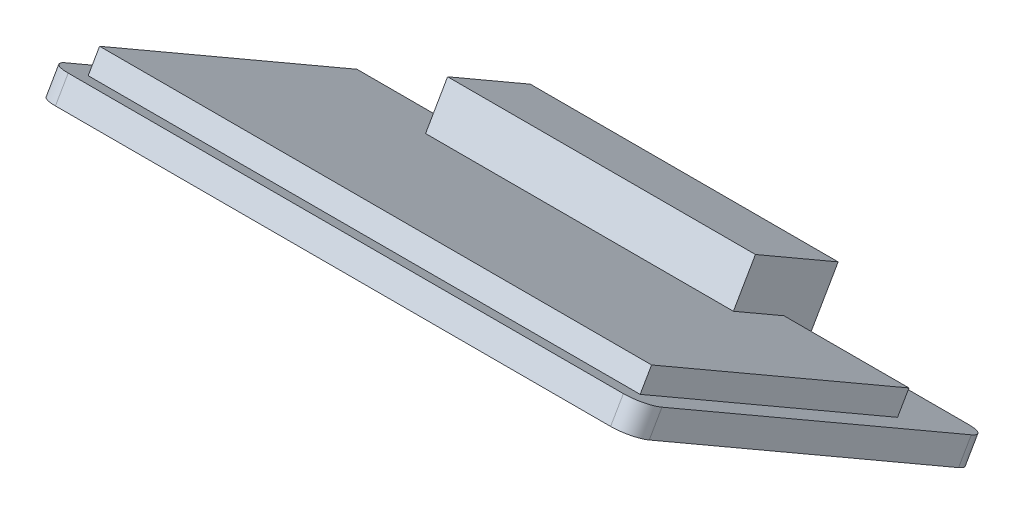
ISO-10303-21;
HEADER;
FILE_DESCRIPTION(('STEP AP214'),'2;1');
FILE_NAME('part.step','',(''),(''),'','','');
FILE_SCHEMA(('AUTOMOTIVE_DESIGN { 1 0 10303 214 1 1 1 1 }'));
ENDSEC;
DATA;
#1=APPLICATION_CONTEXT('core data for automotive mechanical design processes');
#2=APPLICATION_PROTOCOL_DEFINITION('international standard','automotive_design',2000,#1);
#3=PRODUCT_CONTEXT('',#1,'mechanical');
#4=PRODUCT('Part','Part','',(#3));
#5=PRODUCT_RELATED_PRODUCT_CATEGORY('part','',(#4));
#6=PRODUCT_DEFINITION_FORMATION('','',#4);
#7=PRODUCT_DEFINITION_CONTEXT('part definition',#1,'design');
#8=PRODUCT_DEFINITION('design','',#6,#7);
#9=PRODUCT_DEFINITION_SHAPE('','',#8);
#10=(LENGTH_UNIT() NAMED_UNIT(*) SI_UNIT(.MILLI.,.METRE.));
#11=(NAMED_UNIT(*) PLANE_ANGLE_UNIT() SI_UNIT($,.RADIAN.));
#12=(NAMED_UNIT(*) SI_UNIT($,.STERADIAN.) SOLID_ANGLE_UNIT());
#13=UNCERTAINTY_MEASURE_WITH_UNIT(LENGTH_MEASURE(1.E-05),#10,'distance_accuracy_value','');
#14=(GEOMETRIC_REPRESENTATION_CONTEXT(3) GLOBAL_UNCERTAINTY_ASSIGNED_CONTEXT((#13)) GLOBAL_UNIT_ASSIGNED_CONTEXT((#10,
#11,#12)) REPRESENTATION_CONTEXT('',''));
#15=CARTESIAN_POINT('',(0.,0.,0.));
#16=DIRECTION('',(0.,0.,1.));
#17=DIRECTION('',(1.,0.,0.));
#18=AXIS2_PLACEMENT_3D('',#15,#16,#17);
#19=CARTESIAN_POINT('',(-29.55,15.411215932168,24.693009000929));
#20=DIRECTION('',(0.,-0.50000000000019,-0.866025403784329));
#21=DIRECTION('',(0.,-0.866025403784329,0.50000000000019));
#22=AXIS2_PLACEMENT_3D('',#19,#20,#21);
#23=PLANE('',#22);
#24=DIRECTION('',(0.,0.866025403784329,-0.50000000000019));
#25=VECTOR('',#24,1.);
#26=CARTESIAN_POINT('',(-29.55,15.411215932168,24.693009000929));
#27=LINE('',#26,#25);
#28=CARTESIAN_POINT('',(-29.55,15.411215932168,24.693009000929));
#29=VERTEX_POINT('',#28);
#30=CARTESIAN_POINT('',(-29.55,25.28390553531,18.993009000929));
#31=VERTEX_POINT('',#30);
#32=EDGE_CURVE('E343',#29,#31,#27,.T.);
#33=ORIENTED_EDGE('',*,*,#32,.T.);
#34=DIRECTION('',(1.,0.,0.));
#35=VECTOR('',#34,1.);
#36=CARTESIAN_POINT('',(-29.55,25.28390553531,18.993009000929));
#37=LINE('',#36,#35);
#38=CARTESIAN_POINT('',(28.45,25.28390553531,18.993009000929));
#39=VERTEX_POINT('',#38);
#40=EDGE_CURVE('E11',#31,#39,#37,.T.);
#41=ORIENTED_EDGE('',*,*,#40,.T.);
#42=DIRECTION('',(0.,0.866025403784329,-0.50000000000019));
#43=VECTOR('',#42,1.);
#44=CARTESIAN_POINT('',(28.45,15.411215932168,24.693009000929));
#45=LINE('',#44,#43);
#46=CARTESIAN_POINT('',(28.45,15.411215932168,24.693009000929));
#47=VERTEX_POINT('',#46);
#48=EDGE_CURVE('E324',#47,#39,#45,.T.);
#49=ORIENTED_EDGE('',*,*,#48,.F.);
#50=DIRECTION('',(1.,0.,0.));
#51=VECTOR('',#50,1.);
#52=CARTESIAN_POINT('',(-29.55,15.411215932168,24.693009000929));
#53=LINE('',#52,#51);
#54=EDGE_CURVE('E299',#29,#47,#53,.T.);
#55=ORIENTED_EDGE('',*,*,#54,.F.);
#56=EDGE_LOOP('',(#33,#41,#49,#55));
#57=FACE_BOUND('',#56,.T.);
#58=ADVANCED_FACE('F17',(#57),#23,.T.);
#59=CARTESIAN_POINT('',(-0.55,29.78390553531,26.787237634989));
#60=DIRECTION('',(0.,-0.866025403784329,0.50000000000019));
#61=DIRECTION('',(-1.,0.,0.));
#62=AXIS2_PLACEMENT_3D('',#59,#60,#61);
#63=PLANE('',#62);
#64=DIRECTION('',(0.,-0.50000000000019,-0.866025403784329));
#65=VECTOR('',#64,1.);
#66=CARTESIAN_POINT('',(-29.55,34.28390553531,34.581466269049));
#67=LINE('',#66,#65);
#68=CARTESIAN_POINT('',(-29.55,34.28390553531,34.581466269049));
#69=VERTEX_POINT('',#68);
#70=EDGE_CURVE('E298',#69,#31,#67,.T.);
#71=ORIENTED_EDGE('',*,*,#70,.F.);
#72=DIRECTION('',(-1.,0.,0.));
#73=VECTOR('',#72,1.);
#74=CARTESIAN_POINT('',(28.45,34.28390553531,34.581466269049));
#75=LINE('',#74,#73);
#76=CARTESIAN_POINT('',(28.45,34.28390553531,34.581466269049));
#77=VERTEX_POINT('',#76);
#78=EDGE_CURVE('E21',#77,#69,#75,.T.);
#79=ORIENTED_EDGE('',*,*,#78,.F.);
#80=DIRECTION('',(0.,0.50000000000019,0.866025403784329));
#81=VECTOR('',#80,1.);
#82=CARTESIAN_POINT('',(28.45,25.28390553531,18.993009000929));
#83=LINE('',#82,#81);
#84=EDGE_CURVE('E328',#39,#77,#83,.T.);
#85=ORIENTED_EDGE('',*,*,#84,.F.);
#86=ORIENTED_EDGE('',*,*,#40,.F.);
#87=EDGE_LOOP('',(#71,#79,#85,#86));
#88=FACE_BOUND('',#87,.T.);
#89=ADVANCED_FACE('F19',(#88),#63,.F.);
#90=CARTESIAN_POINT('',(28.45,24.411215932168,40.281466269049));
#91=DIRECTION('',(0.,0.50000000000019,0.866025403784329));
#92=DIRECTION('',(1.,0.,0.));
#93=AXIS2_PLACEMENT_3D('',#90,#91,#92);
#94=PLANE('',#93);
#95=DIRECTION('',(-1.,0.,0.));
#96=VECTOR('',#95,1.);
#97=CARTESIAN_POINT('',(14.225,27.095894683899,38.731466269049));
#98=LINE('',#97,#96);
#99=CARTESIAN_POINT('',(28.45,27.095894683899,38.731466269049));
#100=VERTEX_POINT('',#99);
#101=CARTESIAN_POINT('',(-29.55,27.095894683899,38.731466269049));
#102=VERTEX_POINT('',#101);
#103=EDGE_CURVE('E320',#100,#102,#98,.T.);
#104=ORIENTED_EDGE('',*,*,#103,.F.);
#105=DIRECTION('',(0.,0.866025403784329,-0.50000000000019));
#106=VECTOR('',#105,1.);
#107=CARTESIAN_POINT('',(28.45,24.411215932168,40.281466269049));
#108=LINE('',#107,#106);
#109=EDGE_CURVE('E334',#100,#77,#108,.T.);
#110=ORIENTED_EDGE('',*,*,#109,.T.);
#111=ORIENTED_EDGE('',*,*,#78,.T.);
#112=DIRECTION('',(0.,0.866025403784329,-0.50000000000019));
#113=VECTOR('',#112,1.);
#114=CARTESIAN_POINT('',(-29.55,24.411215932168,40.281466269049));
#115=LINE('',#114,#113);
#116=EDGE_CURVE('E294',#102,#69,#115,.T.);
#117=ORIENTED_EDGE('',*,*,#116,.F.);
#118=EDGE_LOOP('',(#104,#110,#111,#117));
#119=FACE_BOUND('',#118,.T.);
#120=ADVANCED_FACE('F438',(#119),#94,.T.);
#121=CARTESIAN_POINT('',(-29.55,24.411215932168,40.281466269049));
#122=DIRECTION('',(-1.,0.,0.));
#123=DIRECTION('',(0.,0.,1.));
#124=AXIS2_PLACEMENT_3D('',#121,#122,#123);
#125=PLANE('',#124);
#126=DIRECTION('',(0.,-0.50000000000019,-0.866025403784329));
#127=VECTOR('',#126,1.);
#128=CARTESIAN_POINT('',(-29.55,31.345894683899,46.092682201217));
#129=LINE('',#128,#127);
#130=CARTESIAN_POINT('',(-29.55,21.595894683899,29.205186827421));
#131=VERTEX_POINT('',#130);
#132=EDGE_CURVE('E321',#102,#131,#129,.T.);
#133=ORIENTED_EDGE('',*,*,#132,.F.);
#134=ORIENTED_EDGE('',*,*,#116,.T.);
#135=ORIENTED_EDGE('',*,*,#70,.T.);
#136=ORIENTED_EDGE('',*,*,#32,.F.);
#137=DIRECTION('',(0.,-0.50000000000019,-0.866025403784329));
#138=VECTOR('',#137,1.);
#139=CARTESIAN_POINT('',(-29.55,24.411215932168,40.281466269049));
#140=LINE('',#139,#138);
#141=CARTESIAN_POINT('',(-29.55,18.911215932168,30.755186827421));
#142=VERTEX_POINT('',#141);
#143=EDGE_CURVE('E336',#142,#29,#140,.T.);
#144=ORIENTED_EDGE('',*,*,#143,.F.);
#145=DIRECTION('',(0.,0.866025403784329,-0.50000000000019));
#146=VECTOR('',#145,1.);
#147=CARTESIAN_POINT('',(-29.55,18.391600689897,31.055186827421));
#148=LINE('',#147,#146);
#149=EDGE_CURVE('E261',#142,#131,#148,.T.);
#150=ORIENTED_EDGE('',*,*,#149,.T.);
#151=EDGE_LOOP('',(#133,#134,#135,#136,#144,#150));
#152=FACE_BOUND('',#151,.T.);
#153=ADVANCED_FACE('F500',(#152),#125,.T.);
#154=CARTESIAN_POINT('',(-0.55,19.911215932168,32.487237634989));
#155=DIRECTION('',(0.,-0.866025403784329,0.50000000000019));
#156=DIRECTION('',(-1.,0.,0.));
#157=AXIS2_PLACEMENT_3D('',#154,#155,#156);
#158=PLANE('',#157);
#159=ORIENTED_EDGE('',*,*,#143,.T.);
#160=ORIENTED_EDGE('',*,*,#54,.T.);
#161=DIRECTION('',(0.,0.50000000000019,0.866025403784329));
#162=VECTOR('',#161,1.);
#163=CARTESIAN_POINT('',(28.45,15.411215932168,24.693009000929));
#164=LINE('',#163,#162);
#165=CARTESIAN_POINT('',(28.45,18.911215932168,30.755186827421));
#166=VERTEX_POINT('',#165);
#167=EDGE_CURVE('E325',#47,#166,#164,.T.);
#168=ORIENTED_EDGE('',*,*,#167,.T.);
#169=DIRECTION('',(-1.,0.,0.));
#170=VECTOR('',#169,1.);
#171=CARTESIAN_POINT('',(-26.275,18.911215932168,30.755186827421));
#172=LINE('',#171,#170);
#173=EDGE_CURVE('E258',#166,#142,#172,.T.);
#174=ORIENTED_EDGE('',*,*,#173,.T.);
#175=EDGE_LOOP('',(#159,#160,#168,#174));
#176=FACE_BOUND('',#175,.T.);
#177=ADVANCED_FACE('F496',(#176),#158,.T.);
#178=CARTESIAN_POINT('',(28.45,15.411215932168,24.693009000929));
#179=DIRECTION('',(1.,0.,0.));
#180=DIRECTION('',(0.,1.,0.));
#181=AXIS2_PLACEMENT_3D('',#178,#179,#180);
#182=PLANE('',#181);
#183=ORIENTED_EDGE('',*,*,#167,.F.);
#184=ORIENTED_EDGE('',*,*,#48,.T.);
#185=ORIENTED_EDGE('',*,*,#84,.T.);
#186=ORIENTED_EDGE('',*,*,#109,.F.);
#187=DIRECTION('',(0.,0.50000000000019,0.866025403784329));
#188=VECTOR('',#187,1.);
#189=CARTESIAN_POINT('',(28.45,26.845894683899,38.298453567157));
#190=LINE('',#189,#188);
#191=CARTESIAN_POINT('',(28.45,21.595894683899,29.205186827421));
#192=VERTEX_POINT('',#191);
#193=EDGE_CURVE('E311',#192,#100,#190,.T.);
#194=ORIENTED_EDGE('',*,*,#193,.F.);
#195=DIRECTION('',(0.,-0.866025403784329,0.50000000000019));
#196=VECTOR('',#195,1.);
#197=CARTESIAN_POINT('',(28.45,18.391600689897,31.055186827421));
#198=LINE('',#197,#196);
#199=EDGE_CURVE('E257',#192,#166,#198,.T.);
#200=ORIENTED_EDGE('',*,*,#199,.T.);
#201=EDGE_LOOP('',(#183,#184,#185,#186,#194,#200));
#202=FACE_BOUND('',#201,.T.);
#203=ADVANCED_FACE('F461',(#202),#182,.T.);
#204=CARTESIAN_POINT('',(0.,35.595894683899,53.453898133385));
#205=DIRECTION('',(0.,-0.866025403784329,0.50000000000019));
#206=DIRECTION('',(-1.,0.,0.));
#207=AXIS2_PLACEMENT_3D('',#204,#205,#206);
#208=PLANE('',#207);
#209=DIRECTION('',(-1.,0.,0.));
#210=VECTOR('',#209,1.);
#211=CARTESIAN_POINT('',(52.,49.595894683899,77.702609439349));
#212=LINE('',#211,#210);
#213=CARTESIAN_POINT('',(52.,49.595894683899,77.702609439349));
#214=VERTEX_POINT('',#213);
#215=CARTESIAN_POINT('',(-52.,49.595894683899,77.702609439349));
#216=VERTEX_POINT('',#215);
#217=EDGE_CURVE('E304',#214,#216,#212,.T.);
#218=ORIENTED_EDGE('',*,*,#217,.F.);
#219=DIRECTION('',(0.,0.50000000000019,0.866025403784329));
#220=VECTOR('',#219,1.);
#221=CARTESIAN_POINT('',(52.,21.595894683899,29.205186827421));
#222=LINE('',#221,#220);
#223=CARTESIAN_POINT('',(52.,21.595894683899,29.205186827421));
#224=VERTEX_POINT('',#223);
#225=EDGE_CURVE('E292',#224,#214,#222,.T.);
#226=ORIENTED_EDGE('',*,*,#225,.F.);
#227=DIRECTION('',(1.,0.,0.));
#228=VECTOR('',#227,1.);
#229=CARTESIAN_POINT('',(-52.,21.595894683899,29.205186827421));
#230=LINE('',#229,#228);
#231=EDGE_CURVE('E286',#192,#224,#230,.T.);
#232=ORIENTED_EDGE('',*,*,#231,.F.);
#233=ORIENTED_EDGE('',*,*,#193,.T.);
#234=ORIENTED_EDGE('',*,*,#103,.T.);
#235=ORIENTED_EDGE('',*,*,#132,.T.);
#236=DIRECTION('',(1.,0.,0.));
#237=VECTOR('',#236,1.);
#238=CARTESIAN_POINT('',(-52.,21.595894683899,29.205186827421));
#239=LINE('',#238,#237);
#240=CARTESIAN_POINT('',(-52.,21.595894683899,29.205186827421));
#241=VERTEX_POINT('',#240);
#242=EDGE_CURVE('E277',#241,#131,#239,.T.);
#243=ORIENTED_EDGE('',*,*,#242,.F.);
#244=DIRECTION('',(0.,-0.50000000000019,-0.866025403784329));
#245=VECTOR('',#244,1.);
#246=CARTESIAN_POINT('',(-52.,49.595894683899,77.702609439349));
#247=LINE('',#246,#245);
#248=EDGE_CURVE('E309',#216,#241,#247,.T.);
#249=ORIENTED_EDGE('',*,*,#248,.F.);
#250=EDGE_LOOP('',(#218,#226,#232,#233,#234,#235,#243,#249));
#251=FACE_BOUND('',#250,.T.);
#252=ADVANCED_FACE('F458',(#251),#208,.F.);
#253=CARTESIAN_POINT('',(-52.,45.871985447626,79.852609439349));
#254=DIRECTION('',(-1.,0.,0.));
#255=DIRECTION('',(0.,0.,1.));
#256=AXIS2_PLACEMENT_3D('',#253,#254,#255);
#257=PLANE('',#256);
#258=DIRECTION('',(0.,0.866025403784329,-0.50000000000019));
#259=VECTOR('',#258,1.);
#260=CARTESIAN_POINT('',(-52.,45.871985447626,79.852609439349));
#261=LINE('',#260,#259);
#262=CARTESIAN_POINT('',(-52.,45.871985447626,79.852609439349));
#263=VERTEX_POINT('',#262);
#264=EDGE_CURVE('E310',#263,#216,#261,.T.);
#265=ORIENTED_EDGE('',*,*,#264,.T.);
#266=ORIENTED_EDGE('',*,*,#248,.T.);
#267=DIRECTION('',(0.,0.866025403784329,-0.50000000000019));
#268=VECTOR('',#267,1.);
#269=CARTESIAN_POINT('',(-52.,17.871985447626,31.355186827421));
#270=LINE('',#269,#268);
#271=CARTESIAN_POINT('',(-52.,17.871985447626,31.355186827421));
#272=VERTEX_POINT('',#271);
#273=EDGE_CURVE('E275',#272,#241,#270,.T.);
#274=ORIENTED_EDGE('',*,*,#273,.F.);
#275=DIRECTION('',(0.,-0.50000000000019,-0.866025403784329));
#276=VECTOR('',#275,1.);
#277=CARTESIAN_POINT('',(-52.,45.871985447626,79.852609439349));
#278=LINE('',#277,#276);
#279=EDGE_CURVE('E237',#263,#272,#278,.T.);
#280=ORIENTED_EDGE('',*,*,#279,.F.);
#281=EDGE_LOOP('',(#265,#266,#274,#280));
#282=FACE_BOUND('',#281,.T.);
#283=ADVANCED_FACE('F459',(#282),#257,.T.);
#284=CARTESIAN_POINT('',(52.,45.871985447626,79.852609439349));
#285=DIRECTION('',(0.,0.50000000000019,0.866025403784329));
#286=DIRECTION('',(1.,0.,0.));
#287=AXIS2_PLACEMENT_3D('',#284,#285,#286);
#288=PLANE('',#287);
#289=DIRECTION('',(0.,0.866025403784329,-0.50000000000019));
#290=VECTOR('',#289,1.);
#291=CARTESIAN_POINT('',(52.,45.871985447626,79.852609439349));
#292=LINE('',#291,#290);
#293=CARTESIAN_POINT('',(52.,45.871985447626,79.852609439349));
#294=VERTEX_POINT('',#293);
#295=EDGE_CURVE('E302',#294,#214,#292,.T.);
#296=ORIENTED_EDGE('',*,*,#295,.T.);
#297=ORIENTED_EDGE('',*,*,#217,.T.);
#298=ORIENTED_EDGE('',*,*,#264,.F.);
#299=DIRECTION('',(-1.,0.,0.));
#300=VECTOR('',#299,1.);
#301=CARTESIAN_POINT('',(52.,45.871985447626,79.852609439349));
#302=LINE('',#301,#300);
#303=EDGE_CURVE('E254',#294,#263,#302,.T.);
#304=ORIENTED_EDGE('',*,*,#303,.F.);
#305=EDGE_LOOP('',(#296,#297,#298,#304));
#306=FACE_BOUND('',#305,.T.);
#307=ADVANCED_FACE('F467',(#306),#288,.T.);
#308=CARTESIAN_POINT('',(52.,17.871985447626,31.355186827421));
#309=DIRECTION('',(1.,0.,0.));
#310=DIRECTION('',(0.,1.,0.));
#311=AXIS2_PLACEMENT_3D('',#308,#309,#310);
#312=PLANE('',#311);
#313=DIRECTION('',(0.,0.866025403784329,-0.50000000000019));
#314=VECTOR('',#313,1.);
#315=CARTESIAN_POINT('',(52.,17.871985447626,31.355186827421));
#316=LINE('',#315,#314);
#317=CARTESIAN_POINT('',(52.,17.871985447626,31.355186827421));
#318=VERTEX_POINT('',#317);
#319=EDGE_CURVE('E289',#318,#224,#316,.T.);
#320=ORIENTED_EDGE('',*,*,#319,.T.);
#321=ORIENTED_EDGE('',*,*,#225,.T.);
#322=ORIENTED_EDGE('',*,*,#295,.F.);
#323=DIRECTION('',(0.,0.50000000000019,0.866025403784329));
#324=VECTOR('',#323,1.);
#325=CARTESIAN_POINT('',(52.,17.871985447626,31.355186827421));
#326=LINE('',#325,#324);
#327=EDGE_CURVE('E253',#318,#294,#326,.T.);
#328=ORIENTED_EDGE('',*,*,#327,.F.);
#329=EDGE_LOOP('',(#320,#321,#322,#328));
#330=FACE_BOUND('',#329,.T.);
#331=ADVANCED_FACE('F466',(#330),#312,.T.);
#332=CARTESIAN_POINT('',(-52.,17.871985447626,31.355186827421));
#333=DIRECTION('',(0.,-0.50000000000019,-0.866025403784329));
#334=DIRECTION('',(0.,-0.866025403784329,0.50000000000019));
#335=AXIS2_PLACEMENT_3D('',#332,#333,#334);
#336=PLANE('',#335);
#337=DIRECTION('',(1.,0.,0.));
#338=VECTOR('',#337,1.);
#339=CARTESIAN_POINT('',(-52.,17.871985447626,31.355186827421));
#340=LINE('',#339,#338);
#341=EDGE_CURVE('E232',#272,#318,#340,.T.);
#342=ORIENTED_EDGE('',*,*,#341,.F.);
#343=ORIENTED_EDGE('',*,*,#273,.T.);
#344=ORIENTED_EDGE('',*,*,#242,.T.);
#345=ORIENTED_EDGE('',*,*,#149,.F.);
#346=ORIENTED_EDGE('',*,*,#173,.F.);
#347=ORIENTED_EDGE('',*,*,#199,.F.);
#348=ORIENTED_EDGE('',*,*,#231,.T.);
#349=ORIENTED_EDGE('',*,*,#319,.F.);
#350=EDGE_LOOP('',(#342,#343,#344,#345,#346,#347,#348,#349));
#351=FACE_BOUND('',#350,.T.);
#352=ADVANCED_FACE('F427',(#351),#336,.T.);
#353=CARTESIAN_POINT('',(56.2,43.715063509461,85.716711054487));
#354=DIRECTION('',(0.,0.50000000000019,0.866025403784329));
#355=DIRECTION('',(1.,0.,0.));
#356=AXIS2_PLACEMENT_3D('',#353,#354,#355);
#357=PLANE('',#356);
#358=DIRECTION('',(-1.,0.,0.));
#359=VECTOR('',#358,1.);
#360=CARTESIAN_POINT('',(56.2,43.715063509461,85.716711054487));
#361=LINE('',#360,#359);
#362=CARTESIAN_POINT('',(52.3,43.715063509461,85.716711054487));
#363=VERTEX_POINT('',#362);
#364=CARTESIAN_POINT('',(-52.3,43.715063509461,85.716711054487));
#365=VERTEX_POINT('',#364);
#366=EDGE_CURVE('E364',#363,#365,#361,.T.);
#367=ORIENTED_EDGE('',*,*,#366,.F.);
#368=DIRECTION('',(0.,0.866025403784329,-0.50000000000019));
#369=VECTOR('',#368,1.);
#370=CARTESIAN_POINT('',(52.3,43.715063509461,85.716711054487));
#371=LINE('',#370,#369);
#372=CARTESIAN_POINT('',(52.3,47.871985447626,83.316711054487));
#373=VERTEX_POINT('',#372);
#374=EDGE_CURVE('E194',#363,#373,#371,.T.);
#375=ORIENTED_EDGE('',*,*,#374,.T.);
#376=DIRECTION('',(-1.,0.,0.));
#377=VECTOR('',#376,1.);
#378=CARTESIAN_POINT('',(56.2,47.871985447626,83.316711054487));
#379=LINE('',#378,#377);
#380=CARTESIAN_POINT('',(-52.3,47.871985447626,83.316711054487));
#381=VERTEX_POINT('',#380);
#382=EDGE_CURVE('E200',#373,#381,#379,.T.);
#383=ORIENTED_EDGE('',*,*,#382,.T.);
#384=DIRECTION('',(0.,0.866025403784329,-0.50000000000019));
#385=VECTOR('',#384,1.);
#386=CARTESIAN_POINT('',(-52.3,43.715063509461,85.716711054487));
#387=LINE('',#386,#385);
#388=EDGE_CURVE('E183',#365,#381,#387,.T.);
#389=ORIENTED_EDGE('',*,*,#388,.F.);
#390=EDGE_LOOP('',(#367,#375,#383,#389));
#391=FACE_BOUND('',#390,.T.);
#392=ADVANCED_FACE('F199',(#391),#357,.T.);
#393=CARTESIAN_POINT('',(52.3,41.765063509461,82.339211979728));
#394=DIRECTION('',(0.,0.866025403784329,-0.50000000000019));
#395=DIRECTION('',(1.,0.,0.));
#396=AXIS2_PLACEMENT_3D('',#393,#394,#395);
#397=CYLINDRICAL_SURFACE('',#396,3.9);
#398=DIRECTION('',(0.,0.866025403784329,-0.50000000000019));
#399=VECTOR('',#398,1.);
#400=CARTESIAN_POINT('',(56.2,41.765063509461,82.339211979728));
#401=LINE('',#400,#399);
#402=CARTESIAN_POINT('',(56.2,41.765063509461,82.339211979728));
#403=VERTEX_POINT('',#402);
#404=CARTESIAN_POINT('',(56.2,45.921985447626,79.939211979728));
#405=VERTEX_POINT('',#404);
#406=EDGE_CURVE('E198',#403,#405,#401,.T.);
#407=ORIENTED_EDGE('',*,*,#406,.T.);
#408=CARTESIAN_POINT('',(52.3,45.921985447626,79.939211979728));
#409=DIRECTION('',(0.,-0.866025403784329,0.50000000000019));
#410=DIRECTION('',(0.,0.50000000000019,0.866025403784329));
#411=AXIS2_PLACEMENT_3D('',#408,#409,#410);
#412=CIRCLE('',#411,3.9);
#413=EDGE_CURVE('E202',#405,#373,#412,.T.);
#414=ORIENTED_EDGE('',*,*,#413,.T.);
#415=ORIENTED_EDGE('',*,*,#374,.F.);
#416=CARTESIAN_POINT('',(52.3,41.765063509461,82.339211979728));
#417=DIRECTION('',(0.,-0.866025403784329,0.50000000000019));
#418=DIRECTION('',(0.,0.50000000000019,0.866025403784329));
#419=AXIS2_PLACEMENT_3D('',#416,#417,#418);
#420=CIRCLE('',#419,3.9);
#421=EDGE_CURVE('E358',#403,#363,#420,.T.);
#422=ORIENTED_EDGE('',*,*,#421,.F.);
#423=EDGE_LOOP('',(#407,#414,#415,#422));
#424=FACE_BOUND('',#423,.T.);
#425=ADVANCED_FACE('F420',(#424),#397,.T.);
#426=CARTESIAN_POINT('',(-52.3,41.765063509461,82.339211979728));
#427=DIRECTION('',(0.,0.866025403784329,-0.50000000000019));
#428=DIRECTION('',(0.,0.50000000000019,0.866025403784329));
#429=AXIS2_PLACEMENT_3D('',#426,#427,#428);
#430=CYLINDRICAL_SURFACE('',#429,3.9);
#431=ORIENTED_EDGE('',*,*,#388,.T.);
#432=CARTESIAN_POINT('',(-52.3,45.921985447626,79.939211979728));
#433=DIRECTION('',(0.,-0.866025403784329,0.50000000000019));
#434=DIRECTION('',(0.,0.50000000000019,0.866025403784329));
#435=AXIS2_PLACEMENT_3D('',#432,#433,#434);
#436=CIRCLE('',#435,3.9);
#437=CARTESIAN_POINT('',(-56.2,45.921985447626,79.939211979728));
#438=VERTEX_POINT('',#437);
#439=EDGE_CURVE('E190',#381,#438,#436,.T.);
#440=ORIENTED_EDGE('',*,*,#439,.T.);
#441=DIRECTION('',(0.,0.866025403784329,-0.50000000000019));
#442=VECTOR('',#441,1.);
#443=CARTESIAN_POINT('',(-56.2,41.765063509461,82.339211979728));
#444=LINE('',#443,#442);
#445=CARTESIAN_POINT('',(-56.2,41.765063509461,82.339211979728));
#446=VERTEX_POINT('',#445);
#447=EDGE_CURVE('E238',#446,#438,#444,.T.);
#448=ORIENTED_EDGE('',*,*,#447,.F.);
#449=CARTESIAN_POINT('',(-52.3,41.765063509461,82.339211979728));
#450=DIRECTION('',(0.,-0.866025403784329,0.50000000000019));
#451=DIRECTION('',(0.,0.50000000000019,0.866025403784329));
#452=AXIS2_PLACEMENT_3D('',#449,#450,#451);
#453=CIRCLE('',#452,3.9);
#454=EDGE_CURVE('E189',#365,#446,#453,.T.);
#455=ORIENTED_EDGE('',*,*,#454,.F.);
#456=EDGE_LOOP('',(#431,#440,#448,#455));
#457=FACE_BOUND('',#456,.T.);
#458=ADVANCED_FACE('F184',(#457),#430,.T.);
#459=CARTESIAN_POINT('',(56.2,6.165063509461,20.678203230276));
#460=DIRECTION('',(1.,0.,0.));
#461=DIRECTION('',(0.,1.,0.));
#462=AXIS2_PLACEMENT_3D('',#459,#460,#461);
#463=PLANE('',#462);
#464=DIRECTION('',(0.,0.50000000000019,0.866025403784329));
#465=VECTOR('',#464,1.);
#466=CARTESIAN_POINT('',(56.2,6.165063509461,20.678203230276));
#467=LINE('',#466,#465);
#468=CARTESIAN_POINT('',(56.2,8.115063509461,24.055702305035));
#469=VERTEX_POINT('',#468);
#470=EDGE_CURVE('E354',#469,#403,#467,.T.);
#471=ORIENTED_EDGE('',*,*,#470,.F.);
#472=DIRECTION('',(0.,0.866025403784329,-0.50000000000019));
#473=VECTOR('',#472,1.);
#474=CARTESIAN_POINT('',(56.2,8.115063509461,24.055702305035));
#475=LINE('',#474,#473);
#476=CARTESIAN_POINT('',(56.2,12.271985447626,21.655702305035));
#477=VERTEX_POINT('',#476);
#478=EDGE_CURVE('E216',#469,#477,#475,.T.);
#479=ORIENTED_EDGE('',*,*,#478,.T.);
#480=DIRECTION('',(0.,0.50000000000019,0.866025403784329));
#481=VECTOR('',#480,1.);
#482=CARTESIAN_POINT('',(56.2,10.321985447626,18.278203230276));
#483=LINE('',#482,#481);
#484=EDGE_CURVE('E250',#477,#405,#483,.T.);
#485=ORIENTED_EDGE('',*,*,#484,.T.);
#486=ORIENTED_EDGE('',*,*,#406,.F.);
#487=EDGE_LOOP('',(#471,#479,#485,#486));
#488=FACE_BOUND('',#487,.T.);
#489=ADVANCED_FACE('F418',(#488),#463,.T.);
#490=CARTESIAN_POINT('',(-56.2,43.715063509461,85.716711054487));
#491=DIRECTION('',(-1.,0.,0.));
#492=DIRECTION('',(0.,0.,1.));
#493=AXIS2_PLACEMENT_3D('',#490,#491,#492);
#494=PLANE('',#493);
#495=DIRECTION('',(0.,-0.50000000000019,-0.866025403784329));
#496=VECTOR('',#495,1.);
#497=CARTESIAN_POINT('',(-56.2,43.715063509461,85.716711054487));
#498=LINE('',#497,#496);
#499=CARTESIAN_POINT('',(-56.2,8.115063509461,24.055702305035));
#500=VERTEX_POINT('',#499);
#501=EDGE_CURVE('E219',#446,#500,#498,.T.);
#502=ORIENTED_EDGE('',*,*,#501,.F.);
#503=ORIENTED_EDGE('',*,*,#447,.T.);
#504=DIRECTION('',(0.,-0.50000000000019,-0.866025403784329));
#505=VECTOR('',#504,1.);
#506=CARTESIAN_POINT('',(-56.2,47.871985447626,83.316711054487));
#507=LINE('',#506,#505);
#508=CARTESIAN_POINT('',(-56.2,12.271985447626,21.655702305035));
#509=VERTEX_POINT('',#508);
#510=EDGE_CURVE('E207',#438,#509,#507,.T.);
#511=ORIENTED_EDGE('',*,*,#510,.T.);
#512=DIRECTION('',(0.,0.866025403784329,-0.50000000000019));
#513=VECTOR('',#512,1.);
#514=CARTESIAN_POINT('',(-56.2,8.115063509461,24.055702305035));
#515=LINE('',#514,#513);
#516=EDGE_CURVE('E225',#500,#509,#515,.T.);
#517=ORIENTED_EDGE('',*,*,#516,.F.);
#518=EDGE_LOOP('',(#502,#503,#511,#517));
#519=FACE_BOUND('',#518,.T.);
#520=ADVANCED_FACE('F385',(#519),#494,.T.);
#521=CARTESIAN_POINT('',(0.,29.096985447626,50.797457142381));
#522=DIRECTION('',(0.,-0.866025403784329,0.50000000000019));
#523=DIRECTION('',(-1.,0.,0.));
#524=AXIS2_PLACEMENT_3D('',#521,#522,#523);
#525=PLANE('',#524);
#526=ORIENTED_EDGE('',*,*,#327,.T.);
#527=ORIENTED_EDGE('',*,*,#303,.T.);
#528=ORIENTED_EDGE('',*,*,#279,.T.);
#529=ORIENTED_EDGE('',*,*,#341,.T.);
#530=EDGE_LOOP('',(#526,#527,#528,#529));
#531=FACE_BOUND('',#530,.T.);
#532=CARTESIAN_POINT('',(-52.3,12.271985447626,21.655702305035));
#533=DIRECTION('',(0.,0.866025403784329,-0.50000000000019));
#534=DIRECTION('',(0.,0.50000000000019,0.866025403784329));
#535=AXIS2_PLACEMENT_3D('',#532,#533,#534);
#536=CIRCLE('',#535,3.9);
#537=CARTESIAN_POINT('',(-52.3,10.321985447626,18.278203230276));
#538=VERTEX_POINT('',#537);
#539=EDGE_CURVE('E223',#538,#509,#536,.T.);
#540=ORIENTED_EDGE('',*,*,#539,.T.);
#541=ORIENTED_EDGE('',*,*,#510,.F.);
#542=ORIENTED_EDGE('',*,*,#439,.F.);
#543=ORIENTED_EDGE('',*,*,#382,.F.);
#544=ORIENTED_EDGE('',*,*,#413,.F.);
#545=ORIENTED_EDGE('',*,*,#484,.F.);
#546=CARTESIAN_POINT('',(52.3,12.271985447626,21.655702305035));
#547=DIRECTION('',(0.,-0.866025403784329,0.50000000000019));
#548=DIRECTION('',(0.,0.50000000000019,0.866025403784329));
#549=AXIS2_PLACEMENT_3D('',#546,#547,#548);
#550=CIRCLE('',#549,3.9);
#551=CARTESIAN_POINT('',(52.3,10.321985447626,18.278203230276));
#552=VERTEX_POINT('',#551);
#553=EDGE_CURVE('E230',#552,#477,#550,.T.);
#554=ORIENTED_EDGE('',*,*,#553,.F.);
#555=DIRECTION('',(1.,0.,0.));
#556=VECTOR('',#555,1.);
#557=CARTESIAN_POINT('',(-56.2,10.321985447626,18.278203230276));
#558=LINE('',#557,#556);
#559=EDGE_CURVE('E392',#538,#552,#558,.T.);
#560=ORIENTED_EDGE('',*,*,#559,.F.);
#561=EDGE_LOOP('',(#540,#541,#542,#543,#544,#545,#554,#560));
#562=FACE_BOUND('',#561,.T.);
#563=ADVANCED_FACE('F208',(#531,#562),#525,.F.);
#564=CARTESIAN_POINT('',(52.3,8.115063509461,24.055702305035));
#565=DIRECTION('',(0.,0.866025403784329,-0.50000000000019));
#566=DIRECTION('',(0.,-0.50000000000019,-0.866025403784329));
#567=AXIS2_PLACEMENT_3D('',#564,#565,#566);
#568=CYLINDRICAL_SURFACE('',#567,3.9);
#569=DIRECTION('',(0.,0.866025403784329,-0.50000000000019));
#570=VECTOR('',#569,1.);
#571=CARTESIAN_POINT('',(52.3,6.165063509461,20.678203230276));
#572=LINE('',#571,#570);
#573=CARTESIAN_POINT('',(52.3,6.165063509461,20.678203230276));
#574=VERTEX_POINT('',#573);
#575=EDGE_CURVE('E398',#574,#552,#572,.T.);
#576=ORIENTED_EDGE('',*,*,#575,.T.);
#577=ORIENTED_EDGE('',*,*,#553,.T.);
#578=ORIENTED_EDGE('',*,*,#478,.F.);
#579=CARTESIAN_POINT('',(52.3,8.115063509461,24.055702305035));
#580=DIRECTION('',(0.,-0.866025403784329,0.50000000000019));
#581=DIRECTION('',(0.,0.50000000000019,0.866025403784329));
#582=AXIS2_PLACEMENT_3D('',#579,#580,#581);
#583=CIRCLE('',#582,3.9);
#584=EDGE_CURVE('E357',#574,#469,#583,.T.);
#585=ORIENTED_EDGE('',*,*,#584,.F.);
#586=EDGE_LOOP('',(#576,#577,#578,#585));
#587=FACE_BOUND('',#586,.T.);
#588=ADVANCED_FACE('F413',(#587),#568,.T.);
#589=CARTESIAN_POINT('',(-52.3,8.115063509461,24.055702305035));
#590=DIRECTION('',(0.,0.866025403784329,-0.50000000000019));
#591=DIRECTION('',(0.,-0.50000000000019,-0.866025403784329));
#592=AXIS2_PLACEMENT_3D('',#589,#590,#591);
#593=CYLINDRICAL_SURFACE('',#592,3.9);
#594=CARTESIAN_POINT('',(-52.3,8.115063509461,24.055702305035));
#595=DIRECTION('',(0.,0.866025403784329,-0.50000000000019));
#596=DIRECTION('',(0.,0.50000000000019,0.866025403784329));
#597=AXIS2_PLACEMENT_3D('',#594,#595,#596);
#598=CIRCLE('',#597,3.9);
#599=CARTESIAN_POINT('',(-52.3,6.165063509461,20.678203230276));
#600=VERTEX_POINT('',#599);
#601=EDGE_CURVE('E226',#600,#500,#598,.T.);
#602=ORIENTED_EDGE('',*,*,#601,.T.);
#603=ORIENTED_EDGE('',*,*,#516,.T.);
#604=ORIENTED_EDGE('',*,*,#539,.F.);
#605=DIRECTION('',(0.,0.866025403784329,-0.50000000000019));
#606=VECTOR('',#605,1.);
#607=CARTESIAN_POINT('',(-52.3,6.165063509461,20.678203230276));
#608=LINE('',#607,#606);
#609=EDGE_CURVE('E387',#600,#538,#608,.T.);
#610=ORIENTED_EDGE('',*,*,#609,.F.);
#611=EDGE_LOOP('',(#602,#603,#604,#610));
#612=FACE_BOUND('',#611,.T.);
#613=ADVANCED_FACE('F383',(#612),#593,.T.);
#614=CARTESIAN_POINT('',(0.,24.940063509461,53.197457142381));
#615=DIRECTION('',(0.,-0.866025403784329,0.50000000000019));
#616=DIRECTION('',(-1.,0.,0.));
#617=AXIS2_PLACEMENT_3D('',#614,#615,#616);
#618=PLANE('',#617);
#619=DIRECTION('',(1.,0.,0.));
#620=VECTOR('',#619,1.);
#621=CARTESIAN_POINT('',(-56.2,6.165063509461,20.678203230276));
#622=LINE('',#621,#620);
#623=EDGE_CURVE('E394',#600,#574,#622,.T.);
#624=ORIENTED_EDGE('',*,*,#623,.T.);
#625=ORIENTED_EDGE('',*,*,#584,.T.);
#626=ORIENTED_EDGE('',*,*,#470,.T.);
#627=ORIENTED_EDGE('',*,*,#421,.T.);
#628=ORIENTED_EDGE('',*,*,#366,.T.);
#629=ORIENTED_EDGE('',*,*,#454,.T.);
#630=ORIENTED_EDGE('',*,*,#501,.T.);
#631=ORIENTED_EDGE('',*,*,#601,.F.);
#632=EDGE_LOOP('',(#624,#625,#626,#627,#628,#629,#630,#631));
#633=FACE_BOUND('',#632,.T.);
#634=ADVANCED_FACE('F377',(#633),#618,.T.);
#635=CARTESIAN_POINT('',(-56.2,6.165063509461,20.678203230276));
#636=DIRECTION('',(0.,-0.50000000000019,-0.866025403784329));
#637=DIRECTION('',(0.,-0.866025403784329,0.50000000000019));
#638=AXIS2_PLACEMENT_3D('',#635,#636,#637);
#639=PLANE('',#638);
#640=ORIENTED_EDGE('',*,*,#623,.F.);
#641=ORIENTED_EDGE('',*,*,#609,.T.);
#642=ORIENTED_EDGE('',*,*,#559,.T.);
#643=ORIENTED_EDGE('',*,*,#575,.F.);
#644=EDGE_LOOP('',(#640,#641,#642,#643));
#645=FACE_BOUND('',#644,.T.);
#646=ADVANCED_FACE('F396',(#645),#639,.T.);
#647=CLOSED_SHELL('',(#58,#89,#120,#153,#177,#203,#252,#283,#307,#331,#352,#392,#425,#458,#489,
#520,#563,#588,#613,#634,#646));
#648=MANIFOLD_SOLID_BREP('B1',#647);
#649=ADVANCED_BREP_SHAPE_REPRESENTATION('',(#18,#648),#14);
#650=SHAPE_DEFINITION_REPRESENTATION(#9,#649);
ENDSEC;
END-ISO-10303-21;
